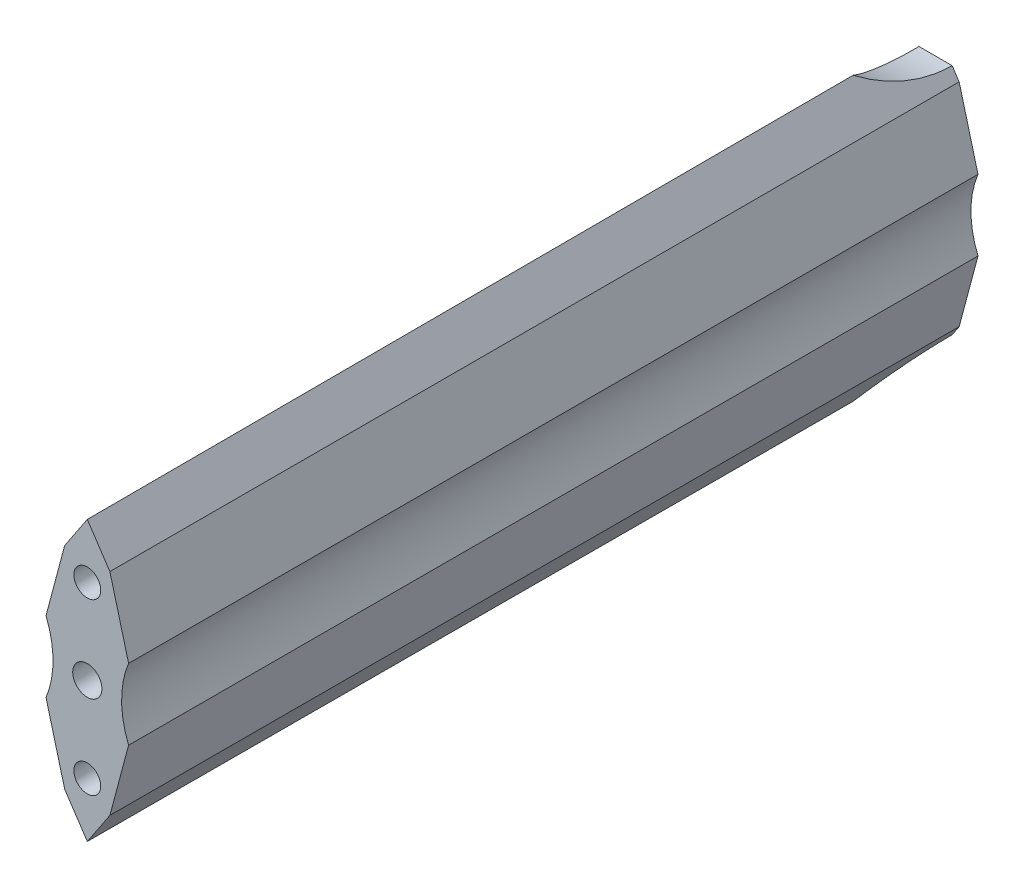
ISO-10303-21;
HEADER;
FILE_DESCRIPTION(('STEP AP214'),'2;1');
FILE_NAME('part.step','',(''),(''),'','','');
FILE_SCHEMA(('AUTOMOTIVE_DESIGN { 1 0 10303 214 1 1 1 1 }'));
ENDSEC;
DATA;
#1=APPLICATION_CONTEXT('core data for automotive mechanical design processes');
#2=APPLICATION_PROTOCOL_DEFINITION('international standard','automotive_design',2000,#1);
#3=PRODUCT_CONTEXT('',#1,'mechanical');
#4=PRODUCT('Part','Part','',(#3));
#5=PRODUCT_RELATED_PRODUCT_CATEGORY('part','',(#4));
#6=PRODUCT_DEFINITION_FORMATION('','',#4);
#7=PRODUCT_DEFINITION_CONTEXT('part definition',#1,'design');
#8=PRODUCT_DEFINITION('design','',#6,#7);
#9=PRODUCT_DEFINITION_SHAPE('','',#8);
#10=(LENGTH_UNIT() NAMED_UNIT(*) SI_UNIT(.MILLI.,.METRE.));
#11=(NAMED_UNIT(*) PLANE_ANGLE_UNIT() SI_UNIT($,.RADIAN.));
#12=(NAMED_UNIT(*) SI_UNIT($,.STERADIAN.) SOLID_ANGLE_UNIT());
#13=UNCERTAINTY_MEASURE_WITH_UNIT(LENGTH_MEASURE(1.E-05),#10,'distance_accuracy_value','');
#14=(GEOMETRIC_REPRESENTATION_CONTEXT(3) GLOBAL_UNCERTAINTY_ASSIGNED_CONTEXT((#13)) GLOBAL_UNIT_ASSIGNED_CONTEXT((#10,
#11,#12)) REPRESENTATION_CONTEXT('',''));
#15=CARTESIAN_POINT('',(0.,0.,0.));
#16=DIRECTION('',(0.,0.,1.));
#17=DIRECTION('',(1.,0.,0.));
#18=AXIS2_PLACEMENT_3D('',#15,#16,#17);
#19=CARTESIAN_POINT('',(0.,0.,709.));
#20=DIRECTION('',(0.,0.,-1.));
#21=DIRECTION('',(-1.,0.,0.));
#22=AXIS2_PLACEMENT_3D('',#19,#20,#21);
#23=CYLINDRICAL_SURFACE('',#22,3.1);
#24=CARTESIAN_POINT('',(0.,0.,180.));
#25=DIRECTION('',(0.,0.,-1.));
#26=DIRECTION('',(-1.,0.,0.));
#27=AXIS2_PLACEMENT_3D('',#24,#25,#26);
#28=CIRCLE('',#27,3.1);
#29=CARTESIAN_POINT('',(-3.1,0.,180.));
#30=VERTEX_POINT('',#29);
#31=EDGE_CURVE('E606',#30,#30,#28,.F.);
#32=ORIENTED_EDGE('',*,*,#31,.T.);
#33=EDGE_LOOP('',(#32));
#34=FACE_BOUND('',#33,.T.);
#35=CARTESIAN_POINT('',(0.,0.,0.));
#36=DIRECTION('',(0.,0.,-1.));
#37=DIRECTION('',(-1.,0.,0.));
#38=AXIS2_PLACEMENT_3D('',#35,#36,#37);
#39=CIRCLE('',#38,3.1);
#40=CARTESIAN_POINT('',(-3.1,0.,0.));
#41=VERTEX_POINT('',#40);
#42=EDGE_CURVE('E415',#41,#41,#39,.F.);
#43=ORIENTED_EDGE('',*,*,#42,.F.);
#44=EDGE_LOOP('',(#43));
#45=FACE_BOUND('',#44,.T.);
#46=ADVANCED_FACE('F273',(#34,#45),#23,.F.);
#47=CARTESIAN_POINT('',(0.,0.,0.));
#48=DIRECTION('',(0.,0.,-1.));
#49=DIRECTION('',(-1.,0.,0.));
#50=AXIS2_PLACEMENT_3D('',#47,#48,#49);
#51=PLANE('',#50);
#52=DIRECTION('',(-0.257662650560332,0.966234939601246,0.));
#53=VECTOR('',#52,1.);
#54=CARTESIAN_POINT('',(5.,22.5,0.));
#55=LINE('',#54,#53);
#56=CARTESIAN_POINT('',(9.,7.5,0.));
#57=VERTEX_POINT('',#56);
#58=CARTESIAN_POINT('',(5.,22.5,0.));
#59=VERTEX_POINT('',#58);
#60=EDGE_CURVE('E379',#57,#59,#55,.T.);
#61=ORIENTED_EDGE('',*,*,#60,.F.);
#62=CARTESIAN_POINT('',(27.,0.,0.));
#63=DIRECTION('',(0.,0.,-1.));
#64=DIRECTION('',(-1.,0.,0.));
#65=AXIS2_PLACEMENT_3D('',#62,#63,#64);
#66=CIRCLE('',#65,19.5);
#67=CARTESIAN_POINT('',(9.,-7.5,0.));
#68=VERTEX_POINT('',#67);
#69=EDGE_CURVE('E439',#68,#57,#66,.T.);
#70=ORIENTED_EDGE('',*,*,#69,.F.);
#71=DIRECTION('',(0.257662650560332,0.966234939601246,0.));
#72=VECTOR('',#71,1.);
#73=CARTESIAN_POINT('',(5.,-22.5,0.));
#74=LINE('',#73,#72);
#75=CARTESIAN_POINT('',(5.00000000000001,-22.5,0.));
#76=VERTEX_POINT('',#75);
#77=EDGE_CURVE('E436',#76,#68,#74,.T.);
#78=ORIENTED_EDGE('',*,*,#77,.F.);
#79=DIRECTION('',(0.554700196225229,0.832050294337844,0.));
#80=VECTOR('',#79,1.);
#81=CARTESIAN_POINT('',(5.,-22.5,0.));
#82=LINE('',#81,#80);
#83=CARTESIAN_POINT('',(3.51043577479044,-24.7343463378144,0.));
#84=VERTEX_POINT('',#83);
#85=EDGE_CURVE('E556',#84,#76,#82,.T.);
#86=ORIENTED_EDGE('',*,*,#85,.F.);
#87=DIRECTION('',(1.,0.,0.));
#88=VECTOR('',#87,1.);
#89=CARTESIAN_POINT('',(-17.0379283421757,-24.7343463378144,0.));
#90=LINE('',#89,#88);
#91=CARTESIAN_POINT('',(-3.51043577479043,-24.7343463378144,0.));
#92=VERTEX_POINT('',#91);
#93=EDGE_CURVE('E596',#84,#92,#90,.F.);
#94=ORIENTED_EDGE('',*,*,#93,.T.);
#95=DIRECTION('',(0.554700196225229,-0.832050294337844,0.));
#96=VECTOR('',#95,1.);
#97=CARTESIAN_POINT('',(-5.,-22.5,0.));
#98=LINE('',#97,#96);
#99=CARTESIAN_POINT('',(-5.,-22.5,0.));
#100=VERTEX_POINT('',#99);
#101=EDGE_CURVE('E559',#100,#92,#98,.T.);
#102=ORIENTED_EDGE('',*,*,#101,.F.);
#103=DIRECTION('',(0.257662650560332,-0.966234939601246,0.));
#104=VECTOR('',#103,1.);
#105=CARTESIAN_POINT('',(-5.,-22.5,0.));
#106=LINE('',#105,#104);
#107=CARTESIAN_POINT('',(-8.99999999999999,-7.5,0.));
#108=VERTEX_POINT('',#107);
#109=EDGE_CURVE('E563',#108,#100,#106,.T.);
#110=ORIENTED_EDGE('',*,*,#109,.F.);
#111=CARTESIAN_POINT('',(-27.,0.,0.));
#112=DIRECTION('',(0.,0.,-1.));
#113=DIRECTION('',(-1.,0.,0.));
#114=AXIS2_PLACEMENT_3D('',#111,#112,#113);
#115=CIRCLE('',#114,19.5);
#116=CARTESIAN_POINT('',(-9.,7.5,0.));
#117=VERTEX_POINT('',#116);
#118=EDGE_CURVE('E539',#117,#108,#115,.T.);
#119=ORIENTED_EDGE('',*,*,#118,.F.);
#120=DIRECTION('',(-0.257662650560332,-0.966234939601246,0.));
#121=VECTOR('',#120,1.);
#122=CARTESIAN_POINT('',(-5.,22.5,0.));
#123=LINE('',#122,#121);
#124=CARTESIAN_POINT('',(-4.99999999999999,22.5,0.));
#125=VERTEX_POINT('',#124);
#126=EDGE_CURVE('E536',#125,#117,#123,.T.);
#127=ORIENTED_EDGE('',*,*,#126,.F.);
#128=DIRECTION('',(-0.554700196225229,-0.832050294337844,0.));
#129=VECTOR('',#128,1.);
#130=CARTESIAN_POINT('',(-5.,22.5,0.));
#131=LINE('',#130,#129);
#132=CARTESIAN_POINT('',(-3.51043577479044,24.7343463378144,0.));
#133=VERTEX_POINT('',#132);
#134=EDGE_CURVE('E533',#133,#125,#131,.T.);
#135=ORIENTED_EDGE('',*,*,#134,.F.);
#136=DIRECTION('',(1.,0.,0.));
#137=VECTOR('',#136,1.);
#138=CARTESIAN_POINT('',(-17.0379283421757,24.7343463378144,0.));
#139=LINE('',#138,#137);
#140=CARTESIAN_POINT('',(3.51043577479044,24.7343463378144,0.));
#141=VERTEX_POINT('',#140);
#142=EDGE_CURVE('E592',#133,#141,#139,.T.);
#143=ORIENTED_EDGE('',*,*,#142,.T.);
#144=DIRECTION('',(-0.554700196225229,0.832050294337844,0.));
#145=VECTOR('',#144,1.);
#146=CARTESIAN_POINT('',(5.,22.5,0.));
#147=LINE('',#146,#145);
#148=EDGE_CURVE('E537',#59,#141,#147,.T.);
#149=ORIENTED_EDGE('',*,*,#148,.F.);
#150=EDGE_LOOP('',(#61,#70,#78,#86,#94,#102,#110,#119,#127,#135,#143,#149));
#151=FACE_BOUND('',#150,.T.);
#152=ORIENTED_EDGE('',*,*,#42,.T.);
#153=EDGE_LOOP('',(#152));
#154=FACE_BOUND('',#153,.T.);
#155=CARTESIAN_POINT('',(0.,-18.,0.));
#156=DIRECTION('',(0.,0.,-1.));
#157=DIRECTION('',(-1.,0.,0.));
#158=AXIS2_PLACEMENT_3D('',#155,#156,#157);
#159=CIRCLE('',#158,2.85);
#160=CARTESIAN_POINT('',(-2.85,-18.,0.));
#161=VERTEX_POINT('',#160);
#162=EDGE_CURVE('E603',#161,#161,#159,.F.);
#163=ORIENTED_EDGE('',*,*,#162,.T.);
#164=EDGE_LOOP('',(#163));
#165=FACE_BOUND('',#164,.T.);
#166=CARTESIAN_POINT('',(0.,18.,0.));
#167=DIRECTION('',(0.,0.,-1.));
#168=DIRECTION('',(-1.,0.,0.));
#169=AXIS2_PLACEMENT_3D('',#166,#167,#168);
#170=CIRCLE('',#169,2.85);
#171=CARTESIAN_POINT('',(-2.85,18.,0.));
#172=VERTEX_POINT('',#171);
#173=EDGE_CURVE('E600',#172,#172,#170,.F.);
#174=ORIENTED_EDGE('',*,*,#173,.T.);
#175=EDGE_LOOP('',(#174));
#176=FACE_BOUND('',#175,.T.);
#177=ADVANCED_FACE('F456',(#151,#154,#165,#176),#51,.T.);
#178=CARTESIAN_POINT('',(0.,-18.,795.));
#179=DIRECTION('',(0.,0.,-1.));
#180=DIRECTION('',(-1.,0.,0.));
#181=AXIS2_PLACEMENT_3D('',#178,#179,#180);
#182=CYLINDRICAL_SURFACE('',#181,2.85);
#183=CARTESIAN_POINT('',(0.,-18.,180.));
#184=DIRECTION('',(0.,0.,-1.));
#185=DIRECTION('',(-1.,0.,0.));
#186=AXIS2_PLACEMENT_3D('',#183,#184,#185);
#187=CIRCLE('',#186,2.85);
#188=CARTESIAN_POINT('',(-2.85,-18.,180.));
#189=VERTEX_POINT('',#188);
#190=EDGE_CURVE('E608',#189,#189,#187,.F.);
#191=ORIENTED_EDGE('',*,*,#190,.T.);
#192=EDGE_LOOP('',(#191));
#193=FACE_BOUND('',#192,.T.);
#194=ORIENTED_EDGE('',*,*,#162,.F.);
#195=EDGE_LOOP('',(#194));
#196=FACE_BOUND('',#195,.T.);
#197=ADVANCED_FACE('F503',(#193,#196),#182,.F.);
#198=CARTESIAN_POINT('',(0.,18.,795.));
#199=DIRECTION('',(0.,0.,-1.));
#200=DIRECTION('',(-1.,0.,0.));
#201=AXIS2_PLACEMENT_3D('',#198,#199,#200);
#202=CYLINDRICAL_SURFACE('',#201,2.85);
#203=CARTESIAN_POINT('',(0.,18.,180.));
#204=DIRECTION('',(0.,0.,-1.));
#205=DIRECTION('',(-1.,0.,0.));
#206=AXIS2_PLACEMENT_3D('',#203,#204,#205);
#207=CIRCLE('',#206,2.85);
#208=CARTESIAN_POINT('',(-2.85,18.,180.));
#209=VERTEX_POINT('',#208);
#210=EDGE_CURVE('E611',#209,#209,#207,.F.);
#211=ORIENTED_EDGE('',*,*,#210,.T.);
#212=EDGE_LOOP('',(#211));
#213=FACE_BOUND('',#212,.T.);
#214=ORIENTED_EDGE('',*,*,#173,.F.);
#215=EDGE_LOOP('',(#214));
#216=FACE_BOUND('',#215,.T.);
#217=ADVANCED_FACE('F509',(#213,#216),#202,.F.);
#218=CARTESIAN_POINT('',(-17.0379283421757,56.5663725943723,0.0358783650051111));
#219=DIRECTION('',(1.,0.,0.));
#220=DIRECTION('',(0.,0.,-1.));
#221=AXIS2_PLACEMENT_3D('',#218,#219,#220);
#222=CYLINDRICAL_SURFACE('',#221,31.8320464760793);
#223=ORIENTED_EDGE('',*,*,#142,.F.);
#224=CARTESIAN_POINT('',(17.7109689634502,56.5663725943723,0.0358783650051111));
#225=DIRECTION('',(-0.832049644299313,0.554699762866209,0.00124999902343864));
#226=DIRECTION('',(0.554701171281788,0.832047531681309,0.00187499377443763));
#227=AXIS2_PLACEMENT_3D('',#224,#225,#226);
#228=ELLIPSE('',#227,38.2573884793686,31.8320464760793);
#229=CARTESIAN_POINT('',(0.,29.9605376344768,17.5118255193677));
#230=VERTEX_POINT('',#229);
#231=EDGE_CURVE('E534',#133,#230,#228,.T.);
#232=ORIENTED_EDGE('',*,*,#231,.T.);
#233=CARTESIAN_POINT('',(-17.7109689634502,56.5663725943723,0.0358783650051111));
#234=DIRECTION('',(0.832049644299313,0.554699762866209,0.00124999902343864));
#235=DIRECTION('',(0.554701171281788,-0.832047531681309,-0.00187499377443763));
#236=AXIS2_PLACEMENT_3D('',#233,#234,#235);
#237=ELLIPSE('',#236,38.2573884793686,31.8320464760793);
#238=EDGE_CURVE('E578',#230,#141,#237,.T.);
#239=ORIENTED_EDGE('',*,*,#238,.T.);
#240=EDGE_LOOP('',(#223,#232,#239));
#241=FACE_BOUND('',#240,.T.);
#242=ADVANCED_FACE('F514',(#241),#222,.F.);
#243=CARTESIAN_POINT('',(-17.0379283421757,-56.5663725943723,0.0358783650051111));
#244=DIRECTION('',(1.,0.,0.));
#245=DIRECTION('',(0.,0.,-1.));
#246=AXIS2_PLACEMENT_3D('',#243,#244,#245);
#247=CYLINDRICAL_SURFACE('',#246,31.8320464760793);
#248=ORIENTED_EDGE('',*,*,#93,.F.);
#249=CARTESIAN_POINT('',(-17.7109689634502,-56.5663725943723,0.0358783650051111));
#250=DIRECTION('',(0.832049644299313,-0.554699762866209,0.00124999902343864));
#251=DIRECTION('',(0.554701171281788,0.832047531681309,-0.00187499377443763));
#252=AXIS2_PLACEMENT_3D('',#249,#250,#251);
#253=ELLIPSE('',#252,38.2573884793686,31.8320464760793);
#254=CARTESIAN_POINT('',(0.,-29.9605376344768,17.5118255193677));
#255=VERTEX_POINT('',#254);
#256=EDGE_CURVE('E588',#84,#255,#253,.T.);
#257=ORIENTED_EDGE('',*,*,#256,.T.);
#258=CARTESIAN_POINT('',(17.7109689634502,-56.5663725943723,0.0358783650051111));
#259=DIRECTION('',(-0.832049644299313,-0.554699762866209,0.00124999902343864));
#260=DIRECTION('',(0.554701171281788,-0.832047531681309,0.00187499377443763));
#261=AXIS2_PLACEMENT_3D('',#258,#259,#260);
#262=ELLIPSE('',#261,38.2573884793686,31.8320464760793);
#263=EDGE_CURVE('E583',#255,#92,#262,.T.);
#264=ORIENTED_EDGE('',*,*,#263,.T.);
#265=EDGE_LOOP('',(#248,#257,#264));
#266=FACE_BOUND('',#265,.T.);
#267=ADVANCED_FACE('F510',(#266),#247,.F.);
#268=CARTESIAN_POINT('',(0.,30.,0.));
#269=DIRECTION('',(-0.832049644299313,0.554699762866209,0.00124999902343864));
#270=DIRECTION('',(-0.554700196225229,-0.832050294337843,0.));
#271=AXIS2_PLACEMENT_3D('',#268,#269,#270);
#272=PLANE('',#271);
#273=DIRECTION('',(-0.554700196225229,-0.832050294337843,0.));
#274=VECTOR('',#273,1.);
#275=CARTESIAN_POINT('',(0.18721131622602,29.8751924558493,180.));
#276=LINE('',#275,#274);
#277=CARTESIAN_POINT('',(0.,29.5943754815103,180.));
#278=VERTEX_POINT('',#277);
#279=CARTESIAN_POINT('',(-4.7921731963667,22.4061156869603,180.));
#280=VERTEX_POINT('',#279);
#281=EDGE_CURVE('E531',#278,#280,#276,.T.);
#282=ORIENTED_EDGE('',*,*,#281,.F.);
#283=DIRECTION('',(0.,0.00225346382548676,-0.99999746094717));
#284=VECTOR('',#283,1.);
#285=CARTESIAN_POINT('',(0.,29.098612181134,400.));
#286=LINE('',#285,#284);
#287=EDGE_CURVE('E277',#278,#230,#286,.T.);
#288=ORIENTED_EDGE('',*,*,#287,.T.);
#289=ORIENTED_EDGE('',*,*,#231,.F.);
#290=ORIENTED_EDGE('',*,*,#134,.T.);
#291=DIRECTION('',(0.00115459242688266,-0.000521579098286261,0.999999197435464));
#292=VECTOR('',#291,1.);
#293=CARTESIAN_POINT('',(-4.53816265859266,22.291368193245,400.));
#294=LINE('',#293,#292);
#295=EDGE_CURVE('E390',#125,#280,#294,.T.);
#296=ORIENTED_EDGE('',*,*,#295,.T.);
#297=EDGE_LOOP('',(#282,#288,#289,#290,#296));
#298=FACE_BOUND('',#297,.T.);
#299=ADVANCED_FACE('F513',(#298),#272,.T.);
#300=CARTESIAN_POINT('',(-5.,22.5,0.));
#301=DIRECTION('',(-0.966234184731084,0.257662449261623,0.00124999902343865));
#302=DIRECTION('',(-0.257662650560333,-0.966234939601246,0.));
#303=AXIS2_PLACEMENT_3D('',#300,#301,#302);
#304=PLANE('',#303);
#305=DIRECTION('',(-0.257662650560333,-0.966234939601246,0.));
#306=VECTOR('',#305,1.);
#307=CARTESIAN_POINT('',(-4.78259713858972,22.4420259036239,180.));
#308=LINE('',#307,#306);
#309=CARTESIAN_POINT('',(-8.7631627344522,7.5149049191396,180.));
#310=VERTEX_POINT('',#309);
#311=EDGE_CURVE('E374',#280,#310,#308,.T.);
#312=ORIENTED_EDGE('',*,*,#311,.F.);
#313=ORIENTED_EDGE('',*,*,#295,.F.);
#314=ORIENTED_EDGE('',*,*,#126,.T.);
#315=DIRECTION('',(0.00131576144292263,8.2805034369932E-05,0.999999130957198));
#316=VECTOR('',#315,1.);
#317=CARTESIAN_POINT('',(-8.47369496544935,7.53312204253245,400.));
#318=LINE('',#317,#316);
#319=EDGE_CURVE('E393',#117,#310,#318,.T.);
#320=ORIENTED_EDGE('',*,*,#319,.T.);
#321=EDGE_LOOP('',(#312,#313,#314,#320));
#322=FACE_BOUND('',#321,.T.);
#323=ADVANCED_FACE('F520',(#322),#304,.T.);
#324=CARTESIAN_POINT('',(5.,22.5,0.));
#325=DIRECTION('',(0.832049644299313,0.554699762866209,0.00124999902343864));
#326=DIRECTION('',(-0.554700196225229,0.832050294337843,0.));
#327=AXIS2_PLACEMENT_3D('',#324,#325,#326);
#328=PLANE('',#327);
#329=DIRECTION('',(-0.554700196225229,0.832050294337843,0.));
#330=VECTOR('',#329,1.);
#331=CARTESIAN_POINT('',(4.81278868377399,22.3751924558493,180.));
#332=LINE('',#331,#330);
#333=CARTESIAN_POINT('',(4.7921731963667,22.4061156869602,180.));
#334=VERTEX_POINT('',#333);
#335=EDGE_CURVE('E364',#334,#278,#332,.T.);
#336=ORIENTED_EDGE('',*,*,#335,.F.);
#337=DIRECTION('',(-0.00115459242688266,-0.000521579098286261,0.999999197435464));
#338=VECTOR('',#337,1.);
#339=CARTESIAN_POINT('',(4.53816265859267,22.291368193245,400.));
#340=LINE('',#339,#338);
#341=EDGE_CURVE('E283',#59,#334,#340,.T.);
#342=ORIENTED_EDGE('',*,*,#341,.F.);
#343=ORIENTED_EDGE('',*,*,#148,.T.);
#344=ORIENTED_EDGE('',*,*,#238,.F.);
#345=ORIENTED_EDGE('',*,*,#287,.F.);
#346=EDGE_LOOP('',(#336,#342,#343,#344,#345));
#347=FACE_BOUND('',#346,.T.);
#348=ADVANCED_FACE('F371',(#347),#328,.T.);
#349=CARTESIAN_POINT('',(-9.,7.5,0.));
#350=CARTESIAN_POINT('',(-7.94738993089869,7.5662440850649,800.));
#351=CARTESIAN_POINT('',(-8.75325555323637,6.9078133277673,0.));
#352=CARTESIAN_POINT('',(-7.70903785971492,6.96604813310095,800.));
#353=CARTESIAN_POINT('',(-8.31825720304425,5.69906975911781,0.));
#354=CARTESIAN_POINT('',(-7.28909415940078,5.74311601064957,800.000000000001));
#355=CARTESIAN_POINT('',(-7.84760675080053,3.8304786498399,0.));
#356=CARTESIAN_POINT('',(-6.83510364276034,3.85745789019627,799.999999999999));
#357=CARTESIAN_POINT('',(-7.5633644339186,1.92460591348961,0.));
#358=CARTESIAN_POINT('',(-6.56107216414013,1.93737438025298,800.));
#359=CARTESIAN_POINT('',(-7.5,0.641535561585432,0.));
#360=CARTESIAN_POINT('',(-6.5,0.645791677394109,800.));
#361=CARTESIAN_POINT('',(-7.5,-0.641535561585428,0.));
#362=CARTESIAN_POINT('',(-6.5,-0.64579167739411,800.));
#363=CARTESIAN_POINT('',(-7.56336443391862,-1.92460591348961,0.));
#364=CARTESIAN_POINT('',(-6.56107216414012,-1.93737438025299,799.999999999999));
#365=CARTESIAN_POINT('',(-7.84760675080051,-3.83047864983989,0.));
#366=CARTESIAN_POINT('',(-6.83510364276035,-3.85745789019627,800.000000000001));
#367=CARTESIAN_POINT('',(-8.31825720304427,-5.69906975911781,0.));
#368=CARTESIAN_POINT('',(-7.28909415940077,-5.74311601064957,800.));
#369=CARTESIAN_POINT('',(-8.75325555323637,-6.90781332776729,0.));
#370=CARTESIAN_POINT('',(-7.70903785971492,-6.96604813310096,800.));
#371=CARTESIAN_POINT('',(-9.,-7.5,0.));
#372=CARTESIAN_POINT('',(-7.94738993089869,-7.5662440850649,800.));
#373=B_SPLINE_SURFACE_WITH_KNOTS('',3,1,((#349,#350),(#351,#352),(#353,#354),(#355,#356),(#357,
#358),(#359,#360),(#361,#362),(#363,#364),(#365,#366),(#367,#368),(#369,#370),(#371,#372)),
.UNSPECIFIED.,.F.,.F.,.F.,(4,1,1,1,2,1,1,1,4),(2,2),(0.,0.125,0.25,0.375,0.5,0.625,0.75,0.875,
1.),(0.,1.),.UNSPECIFIED.);
#374=CARTESIAN_POINT('',(-8.7631627344522,7.5149049191396,180.));
#375=CARTESIAN_POINT('',(-8.63923339095012,7.21425134620903,180.));
#376=CARTESIAN_POINT('',(-8.52275894068814,6.9105898020193,180.));
#377=CARTESIAN_POINT('',(-8.30498406162214,6.29794820535353,180.));
#378=CARTESIAN_POINT('',(-8.20368032971687,5.98896932699577,180.));
#379=CARTESIAN_POINT('',(-7.92258235898886,5.0540295754511,180.));
#380=CARTESIAN_POINT('',(-7.76595055436118,4.4209128949954,180.));
#381=CARTESIAN_POINT('',(-7.53474250876537,3.23782081996032,180.));
#382=CARTESIAN_POINT('',(-7.45141583401843,2.68951778522596,180.));
#383=CARTESIAN_POINT('',(-7.33120222327961,1.5876042494154,180.));
#384=CARTESIAN_POINT('',(-7.29433084524245,1.03399203279663,180.));
#385=CARTESIAN_POINT('',(-7.26734570633331,-0.0745714171011476,180.));
#386=CARTESIAN_POINT('',(-7.27725091510697,-0.629523102384897,180.));
#387=CARTESIAN_POINT('',(-7.34379375611045,-1.73651709336309,180.));
#388=CARTESIAN_POINT('',(-7.40041924236143,-2.28856011769433,180.));
#389=CARTESIAN_POINT('',(-7.53853446415461,-3.23853418696262,180.));
#390=CARTESIAN_POINT('',(-7.60927296380011,-3.63806448409497,180.));
#391=CARTESIAN_POINT('',(-7.77524246432016,-4.43195989402483,180.));
#392=CARTESIAN_POINT('',(-7.87046948111335,-4.82632583606287,180.));
#393=CARTESIAN_POINT('',(-8.08490097762383,-5.6078461495995,180.));
#394=CARTESIAN_POINT('',(-8.20406952093394,-5.99501039045156,180.));
#395=CARTESIAN_POINT('',(-8.46602216495859,-6.76133970606914,180.));
#396=CARTESIAN_POINT('',(-8.6088103198909,-7.14050339494983,180.));
#397=CARTESIAN_POINT('',(-8.76316273445221,-7.5149049191396,180.));
#398=B_SPLINE_CURVE_WITH_KNOTS('',3,(#374,#375,#376,#377,#378,#379,#380,#381,#382,#383,#384,
#385,#386,#387,#388,#389,#390,#391,#392,#393,#394,#395,#396,#397),.UNSPECIFIED.,.F.,.F.,(4,2,2,
2,2,2,2,2,2,2,2,4),(0.,0.975362118039461,1.95051156199705,3.90354780946153,5.56549676604625,
7.22800216423168,8.89118182807097,10.5539292474261,11.7704418116476,12.9867565843028,
14.2012591194413,15.4159703361136),.UNSPECIFIED.);
#399=CARTESIAN_POINT('',(-8.76316273445221,-7.5149049191396,180.));
#400=VERTEX_POINT('',#399);
#401=EDGE_CURVE('E375',#310,#400,#398,.T.);
#402=DIRECTION('',(0.00131576144292262,-8.28050343699494E-05,0.999999130957198));
#403=VECTOR('',#402,1.);
#404=CARTESIAN_POINT('',(-8.47369496544935,-7.53312204253245,400.));
#405=LINE('',#404,#403);
#406=EDGE_CURVE('E398',#108,#400,#405,.T.);
#407=ORIENTED_EDGE('',*,*,#401,.F.);
#408=ORIENTED_EDGE('',*,*,#319,.F.);
#409=ORIENTED_EDGE('',*,*,#118,.T.);
#410=ORIENTED_EDGE('',*,*,#406,.T.);
#411=EDGE_LOOP('',(#407,#408,#409,#410));
#412=FACE_BOUND('',#411,.T.);
#413=ADVANCED_FACE('F468',(#412),#373,.T.);
#414=CARTESIAN_POINT('',(-9.,-7.5,0.));
#415=DIRECTION('',(-0.966234184731084,-0.257662449261623,0.00124999902343865));
#416=DIRECTION('',(0.257662650560333,-0.966234939601246,0.));
#417=AXIS2_PLACEMENT_3D('',#414,#415,#416);
#418=PLANE('',#417);
#419=DIRECTION('',(0.257662650560333,-0.966234939601246,0.));
#420=VECTOR('',#419,1.);
#421=CARTESIAN_POINT('',(-8.78259713858972,-7.44202590362393,180.));
#422=LINE('',#421,#420);
#423=CARTESIAN_POINT('',(-4.7921731963667,-22.4061156869603,180.));
#424=VERTEX_POINT('',#423);
#425=EDGE_CURVE('E465',#400,#424,#422,.T.);
#426=ORIENTED_EDGE('',*,*,#425,.F.);
#427=ORIENTED_EDGE('',*,*,#406,.F.);
#428=ORIENTED_EDGE('',*,*,#109,.T.);
#429=DIRECTION('',(0.00115459242688266,0.000521579098286261,0.999999197435464));
#430=VECTOR('',#429,1.);
#431=CARTESIAN_POINT('',(-4.53816265859266,-22.291368193245,400.));
#432=LINE('',#431,#430);
#433=EDGE_CURVE('E403',#100,#424,#432,.T.);
#434=ORIENTED_EDGE('',*,*,#433,.T.);
#435=EDGE_LOOP('',(#426,#427,#428,#434));
#436=FACE_BOUND('',#435,.T.);
#437=ADVANCED_FACE('F475',(#436),#418,.T.);
#438=CARTESIAN_POINT('',(-5.,-22.5,0.));
#439=DIRECTION('',(-0.832049644299313,-0.554699762866209,0.00124999902343864));
#440=DIRECTION('',(0.554700196225229,-0.832050294337843,0.));
#441=AXIS2_PLACEMENT_3D('',#438,#439,#440);
#442=PLANE('',#441);
#443=DIRECTION('',(0.554700196225229,-0.832050294337843,0.));
#444=VECTOR('',#443,1.);
#445=CARTESIAN_POINT('',(-4.81278868377398,-22.3751924558493,180.));
#446=LINE('',#445,#444);
#447=CARTESIAN_POINT('',(0.,-29.5943754815103,180.));
#448=VERTEX_POINT('',#447);
#449=EDGE_CURVE('E733',#424,#448,#446,.T.);
#450=ORIENTED_EDGE('',*,*,#449,.F.);
#451=ORIENTED_EDGE('',*,*,#433,.F.);
#452=ORIENTED_EDGE('',*,*,#101,.T.);
#453=ORIENTED_EDGE('',*,*,#263,.F.);
#454=DIRECTION('',(0.,0.00225346382548676,0.99999746094717));
#455=VECTOR('',#454,1.);
#456=CARTESIAN_POINT('',(0.,-29.098612181134,400.));
#457=LINE('',#456,#455);
#458=EDGE_CURVE('E408',#255,#448,#457,.T.);
#459=ORIENTED_EDGE('',*,*,#458,.T.);
#460=EDGE_LOOP('',(#450,#451,#452,#453,#459));
#461=FACE_BOUND('',#460,.T.);
#462=ADVANCED_FACE('F485',(#461),#442,.T.);
#463=CARTESIAN_POINT('',(0.,-30.,0.));
#464=DIRECTION('',(0.832049644299313,-0.554699762866209,0.00124999902343864));
#465=DIRECTION('',(0.554700196225229,0.832050294337843,0.));
#466=AXIS2_PLACEMENT_3D('',#463,#464,#465);
#467=PLANE('',#466);
#468=DIRECTION('',(0.554700196225229,0.832050294337843,0.));
#469=VECTOR('',#468,1.);
#470=CARTESIAN_POINT('',(-0.187211316226013,-29.8751924558493,180.));
#471=LINE('',#470,#469);
#472=CARTESIAN_POINT('',(4.7921731963667,-22.4061156869603,180.));
#473=VERTEX_POINT('',#472);
#474=EDGE_CURVE('E441',#448,#473,#471,.T.);
#475=ORIENTED_EDGE('',*,*,#474,.F.);
#476=ORIENTED_EDGE('',*,*,#458,.F.);
#477=ORIENTED_EDGE('',*,*,#256,.F.);
#478=ORIENTED_EDGE('',*,*,#85,.T.);
#479=DIRECTION('',(-0.00115459242688266,0.000521579098286261,0.999999197435464));
#480=VECTOR('',#479,1.);
#481=CARTESIAN_POINT('',(4.53816265859267,-22.291368193245,400.));
#482=LINE('',#481,#480);
#483=EDGE_CURVE('E414',#76,#473,#482,.T.);
#484=ORIENTED_EDGE('',*,*,#483,.T.);
#485=EDGE_LOOP('',(#475,#476,#477,#478,#484));
#486=FACE_BOUND('',#485,.T.);
#487=ADVANCED_FACE('F489',(#486),#467,.T.);
#488=CARTESIAN_POINT('',(5.,-22.5,0.));
#489=DIRECTION('',(0.966234184731084,-0.257662449261622,0.00124999902343865));
#490=DIRECTION('',(0.257662650560332,0.966234939601246,0.));
#491=AXIS2_PLACEMENT_3D('',#488,#489,#490);
#492=PLANE('',#491);
#493=DIRECTION('',(0.257662650560332,0.966234939601246,0.));
#494=VECTOR('',#493,1.);
#495=CARTESIAN_POINT('',(4.78259713858972,-22.4420259036239,180.));
#496=LINE('',#495,#494);
#497=CARTESIAN_POINT('',(8.7631627344522,-7.5149049191396,180.));
#498=VERTEX_POINT('',#497);
#499=EDGE_CURVE('E435',#473,#498,#496,.T.);
#500=ORIENTED_EDGE('',*,*,#499,.F.);
#501=ORIENTED_EDGE('',*,*,#483,.F.);
#502=ORIENTED_EDGE('',*,*,#77,.T.);
#503=DIRECTION('',(-0.00131576144292263,-8.28050343699494E-05,0.999999130957198));
#504=VECTOR('',#503,1.);
#505=CARTESIAN_POINT('',(8.47369496544935,-7.53312204253245,400.));
#506=LINE('',#505,#504);
#507=EDGE_CURVE('E382',#68,#498,#506,.T.);
#508=ORIENTED_EDGE('',*,*,#507,.T.);
#509=EDGE_LOOP('',(#500,#501,#502,#508));
#510=FACE_BOUND('',#509,.T.);
#511=ADVANCED_FACE('F433',(#510),#492,.T.);
#512=CARTESIAN_POINT('',(9.,-7.5,0.));
#513=CARTESIAN_POINT('',(7.94738993089869,-7.5662440850649,800.));
#514=CARTESIAN_POINT('',(8.75325555323637,-6.90781332776729,0.));
#515=CARTESIAN_POINT('',(7.70903785971492,-6.96604813310095,800.));
#516=CARTESIAN_POINT('',(8.31825720304428,-5.69906975911781,0.));
#517=CARTESIAN_POINT('',(7.28909415940079,-5.74311601064957,800.000000000001));
#518=CARTESIAN_POINT('',(7.8476067508005,-3.83047864983989,0.));
#519=CARTESIAN_POINT('',(6.83510364276033,-3.85745789019627,799.999999999999));
#520=CARTESIAN_POINT('',(7.56336443391863,-1.92460591348961,0.));
#521=CARTESIAN_POINT('',(6.56107216414014,-1.93737438025299,800.000000000001));
#522=CARTESIAN_POINT('',(7.5,-0.64153556158543,0.));
#523=CARTESIAN_POINT('',(6.5,-0.645791677394112,800.));
#524=CARTESIAN_POINT('',(7.5,0.64153556158543,0.));
#525=CARTESIAN_POINT('',(6.5,0.645791677394106,800.));
#526=CARTESIAN_POINT('',(7.56336443391863,1.92460591348961,0.));
#527=CARTESIAN_POINT('',(6.56107216414012,1.93737438025298,800.));
#528=CARTESIAN_POINT('',(7.8476067508005,3.83047864983989,0.));
#529=CARTESIAN_POINT('',(6.83510364276035,3.85745789019627,800.));
#530=CARTESIAN_POINT('',(8.31825720304427,5.69906975911781,0.));
#531=CARTESIAN_POINT('',(7.28909415940077,5.74311601064956,800.));
#532=CARTESIAN_POINT('',(8.75325555323637,6.9078133277673,0.));
#533=CARTESIAN_POINT('',(7.70903785971492,6.96604813310095,800.));
#534=CARTESIAN_POINT('',(9.,7.5,0.));
#535=CARTESIAN_POINT('',(7.94738993089869,7.56624408506489,800.));
#536=B_SPLINE_SURFACE_WITH_KNOTS('',3,1,((#512,#513),(#514,#515),(#516,#517),(#518,#519),(#520,
#521),(#522,#523),(#524,#525),(#526,#527),(#528,#529),(#530,#531),(#532,#533),(#534,#535)),
.UNSPECIFIED.,.F.,.F.,.F.,(4,1,1,1,2,1,1,1,4),(2,2),(0.,0.125,0.25,0.375,0.5,0.625,0.75,0.875,
1.),(0.,1.),.UNSPECIFIED.);
#537=CARTESIAN_POINT('',(8.7631627344522,-7.5149049191396,180.));
#538=CARTESIAN_POINT('',(8.63923339095012,-7.21425134620902,180.));
#539=CARTESIAN_POINT('',(8.52275894068814,-6.91058980201929,180.));
#540=CARTESIAN_POINT('',(8.30498406162214,-6.29794820535352,180.));
#541=CARTESIAN_POINT('',(8.20368032971688,-5.98896932699576,180.));
#542=CARTESIAN_POINT('',(7.92258235898886,-5.05402957545108,180.));
#543=CARTESIAN_POINT('',(7.76595055436117,-4.42091289499538,180.));
#544=CARTESIAN_POINT('',(7.53474250876535,-3.2378208199603,180.));
#545=CARTESIAN_POINT('',(7.45141583401843,-2.68951778522594,180.));
#546=CARTESIAN_POINT('',(7.33120222327961,-1.58760424941537,180.));
#547=CARTESIAN_POINT('',(7.29433084524245,-1.0339920327966,180.));
#548=CARTESIAN_POINT('',(7.26734570633331,0.0745714171011724,180.));
#549=CARTESIAN_POINT('',(7.27725091510698,0.629523102384922,180.));
#550=CARTESIAN_POINT('',(7.34379375611045,1.73651709336312,180.));
#551=CARTESIAN_POINT('',(7.40041924236144,2.28856011769436,180.));
#552=CARTESIAN_POINT('',(7.53853446415461,3.23853418696265,180.));
#553=CARTESIAN_POINT('',(7.60927296380011,3.63806448409499,180.));
#554=CARTESIAN_POINT('',(7.77524246432016,4.43195989402485,180.));
#555=CARTESIAN_POINT('',(7.87046948111335,4.82632583606289,180.));
#556=CARTESIAN_POINT('',(8.08490097762384,5.60784614959951,180.));
#557=CARTESIAN_POINT('',(8.20406952093394,5.99501039045156,180.));
#558=CARTESIAN_POINT('',(8.46602216495859,6.76133970606915,180.));
#559=CARTESIAN_POINT('',(8.6088103198909,7.14050339494983,180.));
#560=CARTESIAN_POINT('',(8.7631627344522,7.5149049191396,180.));
#561=B_SPLINE_CURVE_WITH_KNOTS('',3,(#537,#538,#539,#540,#541,#542,#543,#544,#545,#546,#547,
#548,#549,#550,#551,#552,#553,#554,#555,#556,#557,#558,#559,#560),.UNSPECIFIED.,.F.,.F.,(4,2,2,
2,2,2,2,2,2,2,2,4),(0.,0.975362118039466,1.95051156199706,3.90354780946154,5.56549676604627,
7.2280021642317,8.89118182807099,10.5539292474261,11.7704418116476,12.9867565843028,
14.2012591194413,15.4159703361136),.UNSPECIFIED.);
#562=CARTESIAN_POINT('',(8.76316273445221,7.5149049191396,180.));
#563=VERTEX_POINT('',#562);
#564=EDGE_CURVE('E289',#498,#563,#561,.T.);
#565=DIRECTION('',(-0.00131576144292263,8.2805034369932E-05,0.999999130957198));
#566=VECTOR('',#565,1.);
#567=CARTESIAN_POINT('',(8.47369496544934,7.53312204253244,400.));
#568=LINE('',#567,#566);
#569=EDGE_CURVE('E380',#57,#563,#568,.T.);
#570=ORIENTED_EDGE('',*,*,#564,.F.);
#571=ORIENTED_EDGE('',*,*,#507,.F.);
#572=ORIENTED_EDGE('',*,*,#69,.T.);
#573=ORIENTED_EDGE('',*,*,#569,.T.);
#574=EDGE_LOOP('',(#570,#571,#572,#573));
#575=FACE_BOUND('',#574,.T.);
#576=ADVANCED_FACE('F438',(#575),#536,.T.);
#577=CARTESIAN_POINT('',(9.,7.5,0.));
#578=DIRECTION('',(0.966234184731084,0.257662449261622,0.00124999902343865));
#579=DIRECTION('',(-0.257662650560332,0.966234939601246,0.));
#580=AXIS2_PLACEMENT_3D('',#577,#578,#579);
#581=PLANE('',#580);
#582=DIRECTION('',(-0.257662650560332,0.966234939601246,0.));
#583=VECTOR('',#582,1.);
#584=CARTESIAN_POINT('',(8.78259713858972,7.44202590362392,180.));
#585=LINE('',#584,#583);
#586=EDGE_CURVE('E13',#563,#334,#585,.T.);
#587=ORIENTED_EDGE('',*,*,#586,.F.);
#588=ORIENTED_EDGE('',*,*,#569,.F.);
#589=ORIENTED_EDGE('',*,*,#60,.T.);
#590=ORIENTED_EDGE('',*,*,#341,.T.);
#591=EDGE_LOOP('',(#587,#588,#589,#590));
#592=FACE_BOUND('',#591,.T.);
#593=ADVANCED_FACE('F275',(#592),#581,.T.);
#594=CARTESIAN_POINT('',(0.,0.,180.));
#595=DIRECTION('',(0.,0.,-1.));
#596=DIRECTION('',(-1.,0.,0.));
#597=AXIS2_PLACEMENT_3D('',#594,#595,#596);
#598=PLANE('',#597);
#599=ORIENTED_EDGE('',*,*,#190,.F.);
#600=EDGE_LOOP('',(#599));
#601=FACE_BOUND('',#600,.T.);
#602=ORIENTED_EDGE('',*,*,#281,.T.);
#603=ORIENTED_EDGE('',*,*,#311,.T.);
#604=ORIENTED_EDGE('',*,*,#401,.T.);
#605=ORIENTED_EDGE('',*,*,#425,.T.);
#606=ORIENTED_EDGE('',*,*,#449,.T.);
#607=ORIENTED_EDGE('',*,*,#474,.T.);
#608=ORIENTED_EDGE('',*,*,#499,.T.);
#609=ORIENTED_EDGE('',*,*,#564,.T.);
#610=ORIENTED_EDGE('',*,*,#586,.T.);
#611=ORIENTED_EDGE('',*,*,#335,.T.);
#612=EDGE_LOOP('',(#602,#603,#604,#605,#606,#607,#608,#609,#610,#611));
#613=FACE_BOUND('',#612,.T.);
#614=ORIENTED_EDGE('',*,*,#210,.F.);
#615=EDGE_LOOP('',(#614));
#616=FACE_BOUND('',#615,.T.);
#617=ORIENTED_EDGE('',*,*,#31,.F.);
#618=EDGE_LOOP('',(#617));
#619=FACE_BOUND('',#618,.T.);
#620=ADVANCED_FACE('F362',(#601,#613,#616,#619),#598,.F.);
#621=CLOSED_SHELL('',(#46,#177,#197,#217,#242,#267,#299,#323,#348,#413,#437,#462,#487,#511,#576,
#593,#620));
#622=MANIFOLD_SOLID_BREP('B2',#621);
#623=ADVANCED_BREP_SHAPE_REPRESENTATION('',(#18,#622),#14);
#624=SHAPE_DEFINITION_REPRESENTATION(#9,#623);
ENDSEC;
END-ISO-10303-21;
